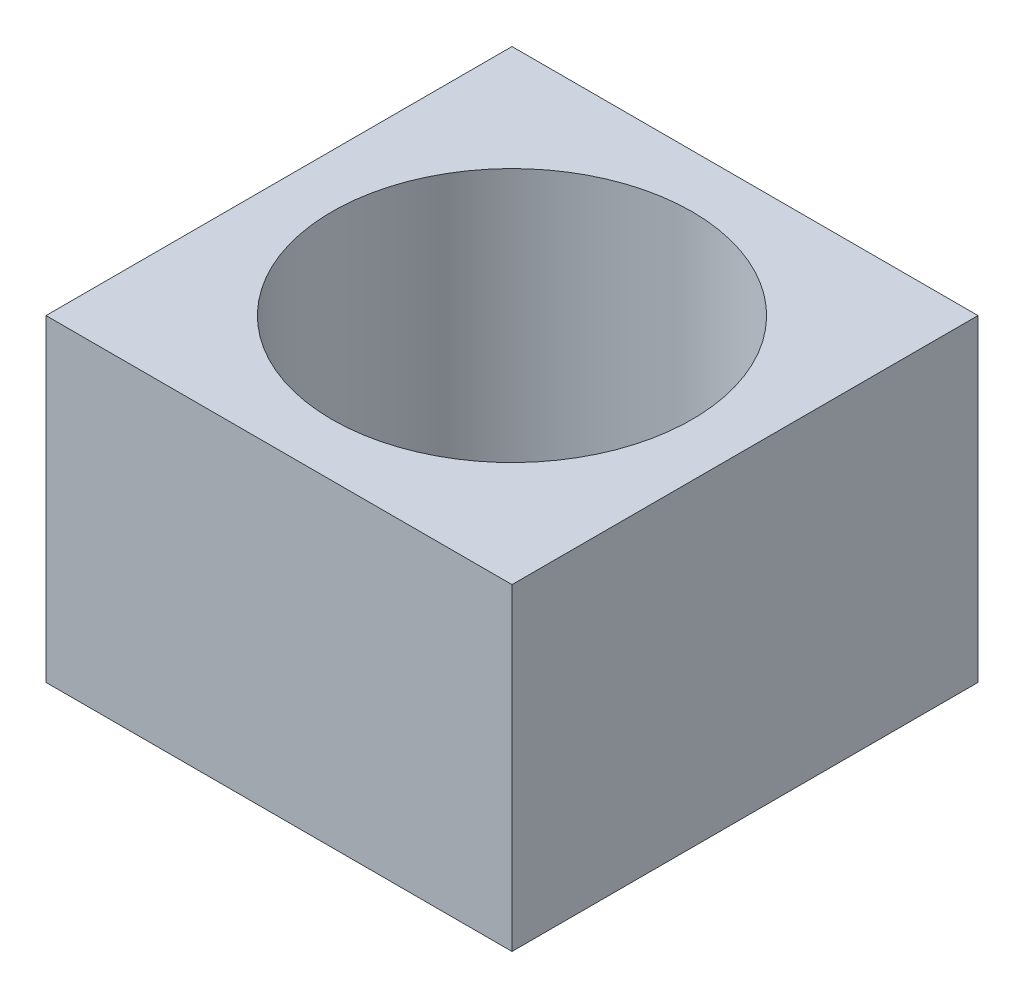
ISO-10303-21;
HEADER;
FILE_DESCRIPTION(('STEP AP214'),'2;1');
FILE_NAME('part.step','',(''),(''),'','','');
FILE_SCHEMA(('AUTOMOTIVE_DESIGN { 1 0 10303 214 1 1 1 1 }'));
ENDSEC;
DATA;
#1=APPLICATION_CONTEXT('core data for automotive mechanical design processes');
#2=APPLICATION_PROTOCOL_DEFINITION('international standard','automotive_design',2000,#1);
#3=PRODUCT_CONTEXT('',#1,'mechanical');
#4=PRODUCT('Part','Part','',(#3));
#5=PRODUCT_RELATED_PRODUCT_CATEGORY('part','',(#4));
#6=PRODUCT_DEFINITION_FORMATION('','',#4);
#7=PRODUCT_DEFINITION_CONTEXT('part definition',#1,'design');
#8=PRODUCT_DEFINITION('design','',#6,#7);
#9=PRODUCT_DEFINITION_SHAPE('','',#8);
#10=(LENGTH_UNIT() NAMED_UNIT(*) SI_UNIT(.MILLI.,.METRE.));
#11=(NAMED_UNIT(*) PLANE_ANGLE_UNIT() SI_UNIT($,.RADIAN.));
#12=(NAMED_UNIT(*) SI_UNIT($,.STERADIAN.) SOLID_ANGLE_UNIT());
#13=UNCERTAINTY_MEASURE_WITH_UNIT(LENGTH_MEASURE(1.E-05),#10,'distance_accuracy_value','');
#14=(GEOMETRIC_REPRESENTATION_CONTEXT(3) GLOBAL_UNCERTAINTY_ASSIGNED_CONTEXT((#13)) GLOBAL_UNIT_ASSIGNED_CONTEXT((#10,
#11,#12)) REPRESENTATION_CONTEXT('',''));
#15=CARTESIAN_POINT('',(0.,0.,0.));
#16=DIRECTION('',(0.,0.,1.));
#17=DIRECTION('',(1.,0.,0.));
#18=AXIS2_PLACEMENT_3D('',#15,#16,#17);
#19=CARTESIAN_POINT('',(-22.,30.,-22.));
#20=DIRECTION('',(0.,0.,-1.));
#21=DIRECTION('',(-1.,0.,0.));
#22=AXIS2_PLACEMENT_3D('',#19,#20,#21);
#23=PLANE('',#22);
#24=DIRECTION('',(1.,0.,0.));
#25=VECTOR('',#24,1.);
#26=CARTESIAN_POINT('',(-22.,0.,-22.));
#27=LINE('',#26,#25);
#28=CARTESIAN_POINT('',(-22.,0.,-22.));
#29=VERTEX_POINT('',#28);
#30=CARTESIAN_POINT('',(22.,0.,-22.));
#31=VERTEX_POINT('',#30);
#32=EDGE_CURVE('E117',#29,#31,#27,.T.);
#33=ORIENTED_EDGE('',*,*,#32,.F.);
#34=DIRECTION('',(0.,-1.,0.));
#35=VECTOR('',#34,1.);
#36=CARTESIAN_POINT('',(-22.,30.,-22.));
#37=LINE('',#36,#35);
#38=CARTESIAN_POINT('',(-22.,30.,-22.));
#39=VERTEX_POINT('',#38);
#40=EDGE_CURVE('E11',#39,#29,#37,.T.);
#41=ORIENTED_EDGE('',*,*,#40,.F.);
#42=DIRECTION('',(1.,0.,0.));
#43=VECTOR('',#42,1.);
#44=CARTESIAN_POINT('',(-22.,30.,-22.));
#45=LINE('',#44,#43);
#46=CARTESIAN_POINT('',(22.,30.,-22.));
#47=VERTEX_POINT('',#46);
#48=EDGE_CURVE('E109',#39,#47,#45,.T.);
#49=ORIENTED_EDGE('',*,*,#48,.T.);
#50=DIRECTION('',(0.,-1.,0.));
#51=VECTOR('',#50,1.);
#52=CARTESIAN_POINT('',(22.,30.,-22.));
#53=LINE('',#52,#51);
#54=EDGE_CURVE('E48',#47,#31,#53,.T.);
#55=ORIENTED_EDGE('',*,*,#54,.T.);
#56=EDGE_LOOP('',(#33,#41,#49,#55));
#57=FACE_BOUND('',#56,.T.);
#58=ADVANCED_FACE('F45',(#57),#23,.T.);
#59=CARTESIAN_POINT('',(-22.,30.,-22.));
#60=DIRECTION('',(1.,0.,0.));
#61=DIRECTION('',(0.,0.,-1.));
#62=AXIS2_PLACEMENT_3D('',#59,#60,#61);
#63=PLANE('',#62);
#64=DIRECTION('',(0.,0.,1.));
#65=VECTOR('',#64,1.);
#66=CARTESIAN_POINT('',(-22.,0.,-22.));
#67=LINE('',#66,#65);
#68=CARTESIAN_POINT('',(-22.,0.,22.));
#69=VERTEX_POINT('',#68);
#70=EDGE_CURVE('E79',#29,#69,#67,.T.);
#71=ORIENTED_EDGE('',*,*,#70,.T.);
#72=DIRECTION('',(0.,-1.,0.));
#73=VECTOR('',#72,1.);
#74=CARTESIAN_POINT('',(-22.,30.,22.));
#75=LINE('',#74,#73);
#76=CARTESIAN_POINT('',(-22.,30.,22.));
#77=VERTEX_POINT('',#76);
#78=EDGE_CURVE('E55',#77,#69,#75,.T.);
#79=ORIENTED_EDGE('',*,*,#78,.F.);
#80=DIRECTION('',(0.,0.,1.));
#81=VECTOR('',#80,1.);
#82=CARTESIAN_POINT('',(-22.,30.,-22.));
#83=LINE('',#82,#81);
#84=EDGE_CURVE('E96',#39,#77,#83,.T.);
#85=ORIENTED_EDGE('',*,*,#84,.F.);
#86=ORIENTED_EDGE('',*,*,#40,.T.);
#87=EDGE_LOOP('',(#71,#79,#85,#86));
#88=FACE_BOUND('',#87,.T.);
#89=ADVANCED_FACE('F134',(#88),#63,.F.);
#90=CARTESIAN_POINT('',(-22.,30.,22.));
#91=DIRECTION('',(0.,0.,-1.));
#92=DIRECTION('',(-1.,0.,0.));
#93=AXIS2_PLACEMENT_3D('',#90,#91,#92);
#94=PLANE('',#93);
#95=DIRECTION('',(1.,0.,0.));
#96=VECTOR('',#95,1.);
#97=CARTESIAN_POINT('',(-22.,0.,22.));
#98=LINE('',#97,#96);
#99=CARTESIAN_POINT('',(22.,0.,22.));
#100=VERTEX_POINT('',#99);
#101=EDGE_CURVE('E104',#69,#100,#98,.T.);
#102=ORIENTED_EDGE('',*,*,#101,.T.);
#103=DIRECTION('',(0.,-1.,0.));
#104=VECTOR('',#103,1.);
#105=CARTESIAN_POINT('',(22.,30.,22.));
#106=LINE('',#105,#104);
#107=CARTESIAN_POINT('',(22.,30.,22.));
#108=VERTEX_POINT('',#107);
#109=EDGE_CURVE('E101',#108,#100,#106,.T.);
#110=ORIENTED_EDGE('',*,*,#109,.F.);
#111=DIRECTION('',(1.,0.,0.));
#112=VECTOR('',#111,1.);
#113=CARTESIAN_POINT('',(-22.,30.,22.));
#114=LINE('',#113,#112);
#115=EDGE_CURVE('E91',#77,#108,#114,.T.);
#116=ORIENTED_EDGE('',*,*,#115,.F.);
#117=ORIENTED_EDGE('',*,*,#78,.T.);
#118=EDGE_LOOP('',(#102,#110,#116,#117));
#119=FACE_BOUND('',#118,.T.);
#120=ADVANCED_FACE('F102',(#119),#94,.F.);
#121=CARTESIAN_POINT('',(22.,30.,-22.));
#122=DIRECTION('',(1.,0.,0.));
#123=DIRECTION('',(0.,0.,-1.));
#124=AXIS2_PLACEMENT_3D('',#121,#122,#123);
#125=PLANE('',#124);
#126=DIRECTION('',(0.,0.,1.));
#127=VECTOR('',#126,1.);
#128=CARTESIAN_POINT('',(22.,0.,-22.));
#129=LINE('',#128,#127);
#130=EDGE_CURVE('E121',#31,#100,#129,.T.);
#131=ORIENTED_EDGE('',*,*,#130,.F.);
#132=ORIENTED_EDGE('',*,*,#54,.F.);
#133=DIRECTION('',(0.,0.,1.));
#134=VECTOR('',#133,1.);
#135=CARTESIAN_POINT('',(22.,30.,-22.));
#136=LINE('',#135,#134);
#137=EDGE_CURVE('E95',#47,#108,#136,.T.);
#138=ORIENTED_EDGE('',*,*,#137,.T.);
#139=ORIENTED_EDGE('',*,*,#109,.T.);
#140=EDGE_LOOP('',(#131,#132,#138,#139));
#141=FACE_BOUND('',#140,.T.);
#142=ADVANCED_FACE('F107',(#141),#125,.T.);
#143=CARTESIAN_POINT('',(0.,30.,0.));
#144=DIRECTION('',(0.,-1.,0.));
#145=DIRECTION('',(0.,0.,-1.));
#146=AXIS2_PLACEMENT_3D('',#143,#144,#145);
#147=PLANE('',#146);
#148=CARTESIAN_POINT('',(0.,30.,0.));
#149=DIRECTION('',(0.,1.,0.));
#150=DIRECTION('',(0.,0.,1.));
#151=AXIS2_PLACEMENT_3D('',#148,#149,#150);
#152=CIRCLE('',#151,17.);
#153=CARTESIAN_POINT('',(0.,30.,17.));
#154=VERTEX_POINT('',#153);
#155=EDGE_CURVE('E122',#154,#154,#152,.T.);
#156=ORIENTED_EDGE('',*,*,#155,.F.);
#157=EDGE_LOOP('',(#156));
#158=FACE_BOUND('',#157,.T.);
#159=ORIENTED_EDGE('',*,*,#48,.F.);
#160=ORIENTED_EDGE('',*,*,#84,.T.);
#161=ORIENTED_EDGE('',*,*,#115,.T.);
#162=ORIENTED_EDGE('',*,*,#137,.F.);
#163=EDGE_LOOP('',(#159,#160,#161,#162));
#164=FACE_BOUND('',#163,.T.);
#165=ADVANCED_FACE('F94',(#158,#164),#147,.F.);
#166=CARTESIAN_POINT('',(0.,0.,0.));
#167=DIRECTION('',(0.,-1.,0.));
#168=DIRECTION('',(0.,0.,-1.));
#169=AXIS2_PLACEMENT_3D('',#166,#167,#168);
#170=PLANE('',#169);
#171=CARTESIAN_POINT('',(0.,0.,0.));
#172=DIRECTION('',(0.,1.,0.));
#173=DIRECTION('',(0.,0.,1.));
#174=AXIS2_PLACEMENT_3D('',#171,#172,#173);
#175=CIRCLE('',#174,17.);
#176=CARTESIAN_POINT('',(0.,0.,17.));
#177=VERTEX_POINT('',#176);
#178=EDGE_CURVE('E165',#177,#177,#175,.T.);
#179=ORIENTED_EDGE('',*,*,#178,.T.);
#180=EDGE_LOOP('',(#179));
#181=FACE_BOUND('',#180,.T.);
#182=ORIENTED_EDGE('',*,*,#32,.T.);
#183=ORIENTED_EDGE('',*,*,#130,.T.);
#184=ORIENTED_EDGE('',*,*,#101,.F.);
#185=ORIENTED_EDGE('',*,*,#70,.F.);
#186=EDGE_LOOP('',(#182,#183,#184,#185));
#187=FACE_BOUND('',#186,.T.);
#188=ADVANCED_FACE('F131',(#181,#187),#170,.T.);
#189=CARTESIAN_POINT('',(0.,30.,0.));
#190=DIRECTION('',(0.,-1.,0.));
#191=DIRECTION('',(0.,0.,-1.));
#192=AXIS2_PLACEMENT_3D('',#189,#190,#191);
#193=CYLINDRICAL_SURFACE('',#192,17.);
#194=ORIENTED_EDGE('',*,*,#155,.T.);
#195=EDGE_LOOP('',(#194));
#196=FACE_BOUND('',#195,.T.);
#197=ORIENTED_EDGE('',*,*,#178,.F.);
#198=EDGE_LOOP('',(#197));
#199=FACE_BOUND('',#198,.T.);
#200=ADVANCED_FACE('F153',(#196,#199),#193,.F.);
#201=CLOSED_SHELL('',(#58,#89,#120,#142,#165,#188,#200));
#202=MANIFOLD_SOLID_BREP('B2',#201);
#203=ADVANCED_BREP_SHAPE_REPRESENTATION('',(#18,#202),#14);
#204=SHAPE_DEFINITION_REPRESENTATION(#9,#203);
ENDSEC;
END-ISO-10303-21;
